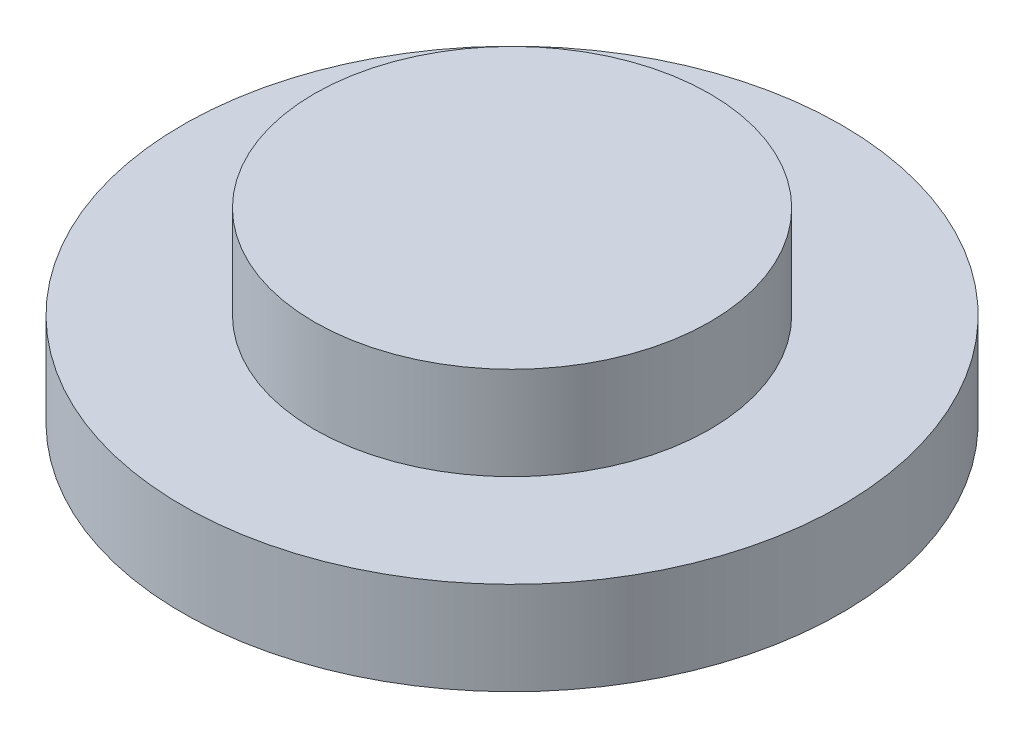
ISO-10303-21;
HEADER;
FILE_DESCRIPTION(('STEP AP214'),'2;1');
FILE_NAME('part.step','',(''),(''),'','','');
FILE_SCHEMA(('AUTOMOTIVE_DESIGN { 1 0 10303 214 1 1 1 1 }'));
ENDSEC;
DATA;
#1=APPLICATION_CONTEXT('core data for automotive mechanical design processes');
#2=APPLICATION_PROTOCOL_DEFINITION('international standard','automotive_design',2000,#1);
#3=PRODUCT_CONTEXT('',#1,'mechanical');
#4=PRODUCT('Part','Part','',(#3));
#5=PRODUCT_RELATED_PRODUCT_CATEGORY('part','',(#4));
#6=PRODUCT_DEFINITION_FORMATION('','',#4);
#7=PRODUCT_DEFINITION_CONTEXT('part definition',#1,'design');
#8=PRODUCT_DEFINITION('design','',#6,#7);
#9=PRODUCT_DEFINITION_SHAPE('','',#8);
#10=(LENGTH_UNIT() NAMED_UNIT(*) SI_UNIT(.MILLI.,.METRE.));
#11=(NAMED_UNIT(*) PLANE_ANGLE_UNIT() SI_UNIT($,.RADIAN.));
#12=(NAMED_UNIT(*) SI_UNIT($,.STERADIAN.) SOLID_ANGLE_UNIT());
#13=UNCERTAINTY_MEASURE_WITH_UNIT(LENGTH_MEASURE(1.E-05),#10,'distance_accuracy_value','');
#14=(GEOMETRIC_REPRESENTATION_CONTEXT(3) GLOBAL_UNCERTAINTY_ASSIGNED_CONTEXT((#13)) GLOBAL_UNIT_ASSIGNED_CONTEXT((#10,
#11,#12)) REPRESENTATION_CONTEXT('',''));
#15=CARTESIAN_POINT('',(0.,0.,0.));
#16=DIRECTION('',(0.,0.,1.));
#17=DIRECTION('',(1.,0.,0.));
#18=AXIS2_PLACEMENT_3D('',#15,#16,#17);
#19=CARTESIAN_POINT('',(44.9999999999999,0.,0.));
#20=DIRECTION('',(0.,-1.,0.));
#21=DIRECTION('',(0.,0.,-1.));
#22=AXIS2_PLACEMENT_3D('',#19,#20,#21);
#23=PLANE('',#22);
#24=CARTESIAN_POINT('',(0.,0.,0.));
#25=DIRECTION('',(0.,-1.,0.));
#26=DIRECTION('',(0.,0.,-1.));
#27=AXIS2_PLACEMENT_3D('',#24,#25,#26);
#28=CIRCLE('',#27,44.9999999999999);
#29=CARTESIAN_POINT('',(0.,0.,-44.9999999999999));
#30=VERTEX_POINT('',#29);
#31=EDGE_CURVE('E46',#30,#30,#28,.T.);
#32=ORIENTED_EDGE('',*,*,#31,.T.);
#33=EDGE_LOOP('',(#32));
#34=FACE_BOUND('',#33,.T.);
#35=ADVANCED_FACE('F32',(#34),#23,.T.);
#36=CARTESIAN_POINT('',(0.,25.4,0.));
#37=DIRECTION('',(0.,1.,0.));
#38=DIRECTION('',(0.,0.,1.));
#39=AXIS2_PLACEMENT_3D('',#36,#37,#38);
#40=PLANE('',#39);
#41=CARTESIAN_POINT('',(0.,25.4,0.));
#42=DIRECTION('',(0.,-1.,0.));
#43=DIRECTION('',(0.,0.,-1.));
#44=AXIS2_PLACEMENT_3D('',#41,#42,#43);
#45=CIRCLE('',#44,27.000000008);
#46=CARTESIAN_POINT('',(0.,25.4,-27.000000008));
#47=VERTEX_POINT('',#46);
#48=EDGE_CURVE('E10',#47,#47,#45,.T.);
#49=ORIENTED_EDGE('',*,*,#48,.F.);
#50=EDGE_LOOP('',(#49));
#51=FACE_BOUND('',#50,.T.);
#52=ADVANCED_FACE('F64',(#51),#40,.T.);
#53=CARTESIAN_POINT('',(0.,0.,0.));
#54=DIRECTION('',(0.,-1.,0.));
#55=DIRECTION('',(0.,0.,-1.));
#56=AXIS2_PLACEMENT_3D('',#53,#54,#55);
#57=CYLINDRICAL_SURFACE('',#56,27.000000008);
#58=ORIENTED_EDGE('',*,*,#48,.T.);
#59=EDGE_LOOP('',(#58));
#60=FACE_BOUND('',#59,.T.);
#61=CARTESIAN_POINT('',(0.,12.7,0.));
#62=DIRECTION('',(0.,-1.,0.));
#63=DIRECTION('',(0.,0.,-1.));
#64=AXIS2_PLACEMENT_3D('',#61,#62,#63);
#65=CIRCLE('',#64,27.000000008);
#66=CARTESIAN_POINT('',(0.,12.7,-27.000000008));
#67=VERTEX_POINT('',#66);
#68=EDGE_CURVE('E38',#67,#67,#65,.T.);
#69=ORIENTED_EDGE('',*,*,#68,.F.);
#70=EDGE_LOOP('',(#69));
#71=FACE_BOUND('',#70,.T.);
#72=ADVANCED_FACE('F61',(#60,#71),#57,.T.);
#73=CARTESIAN_POINT('',(27.000000008,12.7,0.));
#74=DIRECTION('',(0.,1.,0.));
#75=DIRECTION('',(0.,0.,1.));
#76=AXIS2_PLACEMENT_3D('',#73,#74,#75);
#77=PLANE('',#76);
#78=ORIENTED_EDGE('',*,*,#68,.T.);
#79=EDGE_LOOP('',(#78));
#80=FACE_BOUND('',#79,.T.);
#81=CARTESIAN_POINT('',(0.,12.7,0.));
#82=DIRECTION('',(0.,-1.,0.));
#83=DIRECTION('',(0.,0.,-1.));
#84=AXIS2_PLACEMENT_3D('',#81,#82,#83);
#85=CIRCLE('',#84,44.9999999999999);
#86=CARTESIAN_POINT('',(0.,12.7,-44.9999999999999));
#87=VERTEX_POINT('',#86);
#88=EDGE_CURVE('E42',#87,#87,#85,.T.);
#89=ORIENTED_EDGE('',*,*,#88,.F.);
#90=EDGE_LOOP('',(#89));
#91=FACE_BOUND('',#90,.T.);
#92=ADVANCED_FACE('F55',(#80,#91),#77,.T.);
#93=CARTESIAN_POINT('',(0.,0.,0.));
#94=DIRECTION('',(0.,-1.,0.));
#95=DIRECTION('',(0.,0.,-1.));
#96=AXIS2_PLACEMENT_3D('',#93,#94,#95);
#97=CYLINDRICAL_SURFACE('',#96,44.9999999999999);
#98=ORIENTED_EDGE('',*,*,#88,.T.);
#99=EDGE_LOOP('',(#98));
#100=FACE_BOUND('',#99,.T.);
#101=ORIENTED_EDGE('',*,*,#31,.F.);
#102=EDGE_LOOP('',(#101));
#103=FACE_BOUND('',#102,.T.);
#104=ADVANCED_FACE('F53',(#100,#103),#97,.T.);
#105=CLOSED_SHELL('',(#35,#52,#72,#92,#104));
#106=MANIFOLD_SOLID_BREP('B2',#105);
#107=ADVANCED_BREP_SHAPE_REPRESENTATION('',(#18,#106),#14);
#108=SHAPE_DEFINITION_REPRESENTATION(#9,#107);
ENDSEC;
END-ISO-10303-21;
